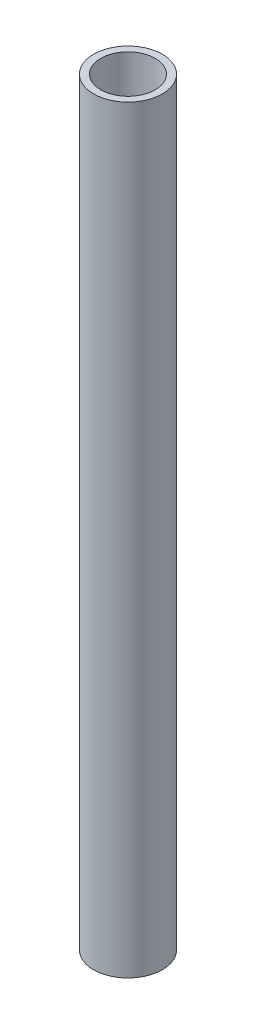
ISO-10303-21;
HEADER;
FILE_DESCRIPTION(('STEP AP214'),'2;1');
FILE_NAME('part.step','',(''),(''),'','','');
FILE_SCHEMA(('AUTOMOTIVE_DESIGN { 1 0 10303 214 1 1 1 1 }'));
ENDSEC;
DATA;
#1=APPLICATION_CONTEXT('core data for automotive mechanical design processes');
#2=APPLICATION_PROTOCOL_DEFINITION('international standard','automotive_design',2000,#1);
#3=PRODUCT_CONTEXT('',#1,'mechanical');
#4=PRODUCT('Part','Part','',(#3));
#5=PRODUCT_RELATED_PRODUCT_CATEGORY('part','',(#4));
#6=PRODUCT_DEFINITION_FORMATION('','',#4);
#7=PRODUCT_DEFINITION_CONTEXT('part definition',#1,'design');
#8=PRODUCT_DEFINITION('design','',#6,#7);
#9=PRODUCT_DEFINITION_SHAPE('','',#8);
#10=(LENGTH_UNIT() NAMED_UNIT(*) SI_UNIT(.MILLI.,.METRE.));
#11=(NAMED_UNIT(*) PLANE_ANGLE_UNIT() SI_UNIT($,.RADIAN.));
#12=(NAMED_UNIT(*) SI_UNIT($,.STERADIAN.) SOLID_ANGLE_UNIT());
#13=UNCERTAINTY_MEASURE_WITH_UNIT(LENGTH_MEASURE(1.E-05),#10,'distance_accuracy_value','');
#14=(GEOMETRIC_REPRESENTATION_CONTEXT(3) GLOBAL_UNCERTAINTY_ASSIGNED_CONTEXT((#13)) GLOBAL_UNIT_ASSIGNED_CONTEXT((#10,
#11,#12)) REPRESENTATION_CONTEXT('',''));
#15=CARTESIAN_POINT('',(0.,0.,0.));
#16=DIRECTION('',(0.,0.,1.));
#17=DIRECTION('',(1.,0.,0.));
#18=AXIS2_PLACEMENT_3D('',#15,#16,#17);
#19=CARTESIAN_POINT('',(0.,320.,0.));
#20=DIRECTION('',(0.,-1.,0.));
#21=DIRECTION('',(0.,0.,-1.));
#22=AXIS2_PLACEMENT_3D('',#19,#20,#21);
#23=CYLINDRICAL_SURFACE('',#22,14.5);
#24=CARTESIAN_POINT('',(0.,320.,0.));
#25=DIRECTION('',(0.,1.,0.));
#26=DIRECTION('',(0.,0.,1.));
#27=AXIS2_PLACEMENT_3D('',#24,#25,#26);
#28=CIRCLE('',#27,14.5);
#29=CARTESIAN_POINT('',(0.,320.,14.5));
#30=VERTEX_POINT('',#29);
#31=EDGE_CURVE('E10',#30,#30,#28,.T.);
#32=ORIENTED_EDGE('',*,*,#31,.F.);
#33=EDGE_LOOP('',(#32));
#34=FACE_BOUND('',#33,.T.);
#35=CARTESIAN_POINT('',(0.,0.,0.));
#36=DIRECTION('',(0.,1.,0.));
#37=DIRECTION('',(0.,0.,1.));
#38=AXIS2_PLACEMENT_3D('',#35,#36,#37);
#39=CIRCLE('',#38,14.5);
#40=CARTESIAN_POINT('',(0.,0.,14.5));
#41=VERTEX_POINT('',#40);
#42=EDGE_CURVE('E37',#41,#41,#39,.T.);
#43=ORIENTED_EDGE('',*,*,#42,.T.);
#44=EDGE_LOOP('',(#43));
#45=FACE_BOUND('',#44,.T.);
#46=ADVANCED_FACE('F34',(#34,#45),#23,.T.);
#47=CARTESIAN_POINT('',(0.,320.,0.));
#48=DIRECTION('',(0.,1.,0.));
#49=DIRECTION('',(0.,0.,1.));
#50=AXIS2_PLACEMENT_3D('',#47,#48,#49);
#51=PLANE('',#50);
#52=CARTESIAN_POINT('',(0.,320.,0.));
#53=DIRECTION('',(0.,1.,0.));
#54=DIRECTION('',(0.,0.,1.));
#55=AXIS2_PLACEMENT_3D('',#52,#53,#54);
#56=CIRCLE('',#55,11.5);
#57=CARTESIAN_POINT('',(0.,320.,11.5));
#58=VERTEX_POINT('',#57);
#59=EDGE_CURVE('E44',#58,#58,#56,.T.);
#60=ORIENTED_EDGE('',*,*,#59,.F.);
#61=EDGE_LOOP('',(#60));
#62=FACE_BOUND('',#61,.T.);
#63=ORIENTED_EDGE('',*,*,#31,.T.);
#64=EDGE_LOOP('',(#63));
#65=FACE_BOUND('',#64,.T.);
#66=ADVANCED_FACE('F55',(#62,#65),#51,.T.);
#67=CARTESIAN_POINT('',(0.,0.,0.));
#68=DIRECTION('',(0.,1.,0.));
#69=DIRECTION('',(0.,0.,1.));
#70=AXIS2_PLACEMENT_3D('',#67,#68,#69);
#71=PLANE('',#70);
#72=CARTESIAN_POINT('',(0.,0.,0.));
#73=DIRECTION('',(0.,1.,0.));
#74=DIRECTION('',(0.,0.,1.));
#75=AXIS2_PLACEMENT_3D('',#72,#73,#74);
#76=CIRCLE('',#75,11.5);
#77=CARTESIAN_POINT('',(0.,0.,11.5));
#78=VERTEX_POINT('',#77);
#79=EDGE_CURVE('E46',#78,#78,#76,.T.);
#80=ORIENTED_EDGE('',*,*,#79,.T.);
#81=EDGE_LOOP('',(#80));
#82=FACE_BOUND('',#81,.T.);
#83=ORIENTED_EDGE('',*,*,#42,.F.);
#84=EDGE_LOOP('',(#83));
#85=FACE_BOUND('',#84,.T.);
#86=ADVANCED_FACE('F57',(#82,#85),#71,.F.);
#87=CARTESIAN_POINT('',(0.,320.,0.));
#88=DIRECTION('',(0.,-1.,0.));
#89=DIRECTION('',(0.,0.,-1.));
#90=AXIS2_PLACEMENT_3D('',#87,#88,#89);
#91=CYLINDRICAL_SURFACE('',#90,11.5);
#92=ORIENTED_EDGE('',*,*,#59,.T.);
#93=EDGE_LOOP('',(#92));
#94=FACE_BOUND('',#93,.T.);
#95=ORIENTED_EDGE('',*,*,#79,.F.);
#96=EDGE_LOOP('',(#95));
#97=FACE_BOUND('',#96,.T.);
#98=ADVANCED_FACE('F52',(#94,#97),#91,.F.);
#99=CLOSED_SHELL('',(#46,#66,#86,#98));
#100=MANIFOLD_SOLID_BREP('B2',#99);
#101=ADVANCED_BREP_SHAPE_REPRESENTATION('',(#18,#100),#14);
#102=SHAPE_DEFINITION_REPRESENTATION(#9,#101);
ENDSEC;
END-ISO-10303-21;
